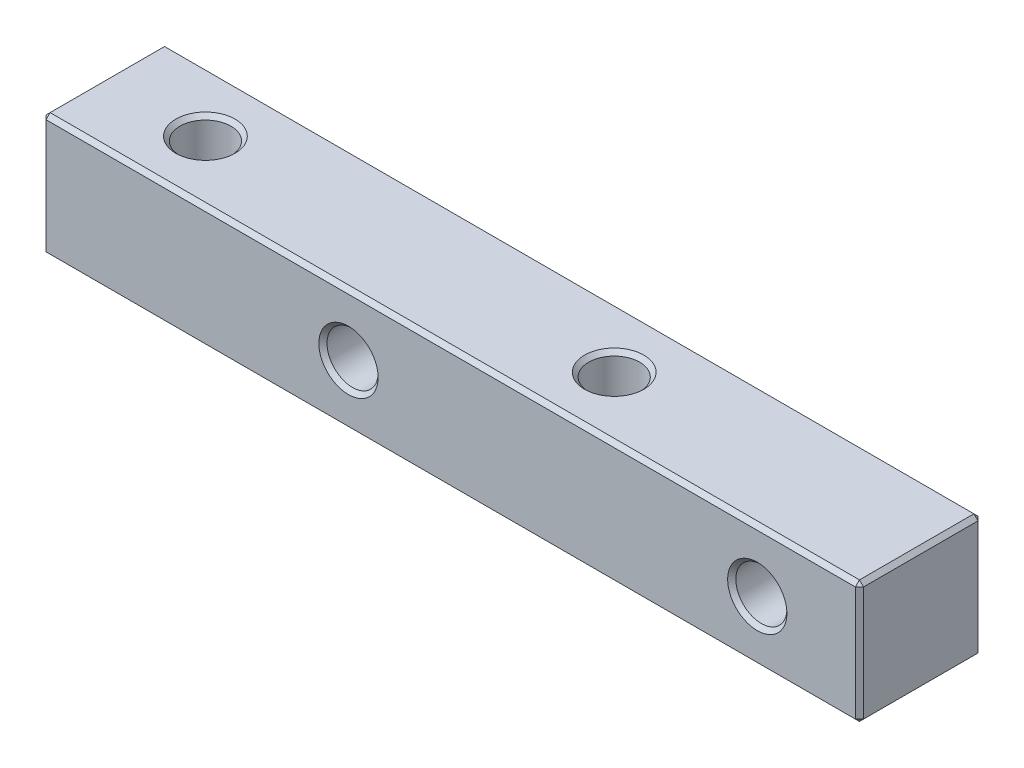
ISO-10303-21;
HEADER;
FILE_DESCRIPTION(('STEP AP214'),'2;1');
FILE_NAME('part.step','',(''),(''),'','','');
FILE_SCHEMA(('AUTOMOTIVE_DESIGN { 1 0 10303 214 1 1 1 1 }'));
ENDSEC;
DATA;
#1=APPLICATION_CONTEXT('core data for automotive mechanical design processes');
#2=APPLICATION_PROTOCOL_DEFINITION('international standard','automotive_design',2000,#1);
#3=PRODUCT_CONTEXT('',#1,'mechanical');
#4=PRODUCT('Part','Part','',(#3));
#5=PRODUCT_RELATED_PRODUCT_CATEGORY('part','',(#4));
#6=PRODUCT_DEFINITION_FORMATION('','',#4);
#7=PRODUCT_DEFINITION_CONTEXT('part definition',#1,'design');
#8=PRODUCT_DEFINITION('design','',#6,#7);
#9=PRODUCT_DEFINITION_SHAPE('','',#8);
#10=(LENGTH_UNIT() NAMED_UNIT(*) SI_UNIT(.MILLI.,.METRE.));
#11=(NAMED_UNIT(*) PLANE_ANGLE_UNIT() SI_UNIT($,.RADIAN.));
#12=(NAMED_UNIT(*) SI_UNIT($,.STERADIAN.) SOLID_ANGLE_UNIT());
#13=UNCERTAINTY_MEASURE_WITH_UNIT(LENGTH_MEASURE(1.E-05),#10,'distance_accuracy_value','');
#14=(GEOMETRIC_REPRESENTATION_CONTEXT(3) GLOBAL_UNCERTAINTY_ASSIGNED_CONTEXT((#13)) GLOBAL_UNIT_ASSIGNED_CONTEXT((#10,
#11,#12)) REPRESENTATION_CONTEXT('',''));
#15=CARTESIAN_POINT('',(0.,0.,0.));
#16=DIRECTION('',(0.,0.,1.));
#17=DIRECTION('',(1.,0.,0.));
#18=AXIS2_PLACEMENT_3D('',#15,#16,#17);
#19=CARTESIAN_POINT('',(20.,3.,-3.));
#20=DIRECTION('',(-1.,0.,0.));
#21=DIRECTION('',(0.,0.,1.));
#22=AXIS2_PLACEMENT_3D('',#19,#20,#21);
#23=PLANE('',#22);
#24=DIRECTION('',(0.,-1.,0.));
#25=VECTOR('',#24,1.);
#26=CARTESIAN_POINT('',(20.,3.,2.80000000000001));
#27=LINE('',#26,#25);
#28=CARTESIAN_POINT('',(20.,2.80000000000001,2.80000000000001));
#29=VERTEX_POINT('',#28);
#30=CARTESIAN_POINT('',(20.,-2.80000000000001,2.80000000000001));
#31=VERTEX_POINT('',#30);
#32=EDGE_CURVE('E240',#29,#31,#27,.T.);
#33=ORIENTED_EDGE('',*,*,#32,.T.);
#34=DIRECTION('',(0.,0.,-1.));
#35=VECTOR('',#34,1.);
#36=CARTESIAN_POINT('',(20.,-2.80000000000001,-3.));
#37=LINE('',#36,#35);
#38=CARTESIAN_POINT('',(20.,-2.80000000000001,-2.80000000000001));
#39=VERTEX_POINT('',#38);
#40=EDGE_CURVE('E242',#31,#39,#37,.T.);
#41=ORIENTED_EDGE('',*,*,#40,.T.);
#42=DIRECTION('',(0.,1.,0.));
#43=VECTOR('',#42,1.);
#44=CARTESIAN_POINT('',(20.,3.,-2.80000000000001));
#45=LINE('',#44,#43);
#46=CARTESIAN_POINT('',(20.,2.80000000000001,-2.80000000000001));
#47=VERTEX_POINT('',#46);
#48=EDGE_CURVE('E236',#39,#47,#45,.T.);
#49=ORIENTED_EDGE('',*,*,#48,.T.);
#50=DIRECTION('',(0.,0.,1.));
#51=VECTOR('',#50,1.);
#52=CARTESIAN_POINT('',(20.,2.80000000000001,3.));
#53=LINE('',#52,#51);
#54=EDGE_CURVE('E238',#47,#29,#53,.T.);
#55=ORIENTED_EDGE('',*,*,#54,.T.);
#56=EDGE_LOOP('',(#33,#41,#49,#55));
#57=FACE_BOUND('',#56,.T.);
#58=ADVANCED_FACE('F40',(#57),#23,.F.);
#59=CARTESIAN_POINT('',(-20.,3.,-3.));
#60=DIRECTION('',(0.,0.,1.));
#61=DIRECTION('',(1.,0.,0.));
#62=AXIS2_PLACEMENT_3D('',#59,#60,#61);
#63=PLANE('',#62);
#64=DIRECTION('',(1.,0.,0.));
#65=VECTOR('',#64,1.);
#66=CARTESIAN_POINT('',(20.,2.80000000000001,-3.));
#67=LINE('',#66,#65);
#68=CARTESIAN_POINT('',(-19.8,2.80000000000001,-3.));
#69=VERTEX_POINT('',#68);
#70=CARTESIAN_POINT('',(19.8,2.80000000000001,-3.));
#71=VERTEX_POINT('',#70);
#72=EDGE_CURVE('E50',#69,#71,#67,.T.);
#73=ORIENTED_EDGE('',*,*,#72,.T.);
#74=DIRECTION('',(0.,-1.,0.));
#75=VECTOR('',#74,1.);
#76=CARTESIAN_POINT('',(19.8,3.,-3.));
#77=LINE('',#76,#75);
#78=CARTESIAN_POINT('',(19.8,-2.80000000000001,-3.));
#79=VERTEX_POINT('',#78);
#80=EDGE_CURVE('E11',#71,#79,#77,.T.);
#81=ORIENTED_EDGE('',*,*,#80,.T.);
#82=DIRECTION('',(-1.,0.,0.));
#83=VECTOR('',#82,1.);
#84=CARTESIAN_POINT('',(-20.,-2.80000000000001,-3.));
#85=LINE('',#84,#83);
#86=CARTESIAN_POINT('',(-19.8,-2.80000000000001,-3.));
#87=VERTEX_POINT('',#86);
#88=EDGE_CURVE('E251',#79,#87,#85,.T.);
#89=ORIENTED_EDGE('',*,*,#88,.T.);
#90=DIRECTION('',(0.,1.,0.));
#91=VECTOR('',#90,1.);
#92=CARTESIAN_POINT('',(-19.8,3.,-3.));
#93=LINE('',#92,#91);
#94=EDGE_CURVE('E61',#87,#69,#93,.T.);
#95=ORIENTED_EDGE('',*,*,#94,.T.);
#96=EDGE_LOOP('',(#73,#81,#89,#95));
#97=FACE_BOUND('',#96,.T.);
#98=CARTESIAN_POINT('',(-5.,0.,-3.));
#99=DIRECTION('',(0.,0.,1.));
#100=DIRECTION('',(1.,0.,0.));
#101=AXIS2_PLACEMENT_3D('',#98,#99,#100);
#102=CIRCLE('',#101,1.44999999999998);
#103=CARTESIAN_POINT('',(-3.55000000000002,0.,-3.));
#104=VERTEX_POINT('',#103);
#105=EDGE_CURVE('E248',#104,#104,#102,.T.);
#106=ORIENTED_EDGE('',*,*,#105,.T.);
#107=EDGE_LOOP('',(#106));
#108=FACE_BOUND('',#107,.T.);
#109=CARTESIAN_POINT('',(15.,0.,-3.));
#110=DIRECTION('',(0.,0.,1.));
#111=DIRECTION('',(1.,0.,0.));
#112=AXIS2_PLACEMENT_3D('',#109,#110,#111);
#113=CIRCLE('',#112,1.44999999999998);
#114=CARTESIAN_POINT('',(16.45,0.,-3.));
#115=VERTEX_POINT('',#114);
#116=EDGE_CURVE('E245',#115,#115,#113,.T.);
#117=ORIENTED_EDGE('',*,*,#116,.T.);
#118=EDGE_LOOP('',(#117));
#119=FACE_BOUND('',#118,.T.);
#120=ADVANCED_FACE('F323',(#97,#108,#119),#63,.F.);
#121=CARTESIAN_POINT('',(-20.,3.,-3.));
#122=DIRECTION('',(1.,0.,0.));
#123=DIRECTION('',(0.,0.,-1.));
#124=AXIS2_PLACEMENT_3D('',#121,#122,#123);
#125=PLANE('',#124);
#126=DIRECTION('',(0.,-1.,0.));
#127=VECTOR('',#126,1.);
#128=CARTESIAN_POINT('',(-20.,3.,-2.80000000000001));
#129=LINE('',#128,#127);
#130=CARTESIAN_POINT('',(-20.,2.80000000000001,-2.80000000000001));
#131=VERTEX_POINT('',#130);
#132=CARTESIAN_POINT('',(-20.,-2.80000000000001,-2.80000000000001));
#133=VERTEX_POINT('',#132);
#134=EDGE_CURVE('E229',#131,#133,#129,.T.);
#135=ORIENTED_EDGE('',*,*,#134,.T.);
#136=DIRECTION('',(0.,0.,1.));
#137=VECTOR('',#136,1.);
#138=CARTESIAN_POINT('',(-20.,-2.80000000000001,-3.));
#139=LINE('',#138,#137);
#140=CARTESIAN_POINT('',(-20.,-2.80000000000001,2.80000000000001));
#141=VERTEX_POINT('',#140);
#142=EDGE_CURVE('E137',#133,#141,#139,.T.);
#143=ORIENTED_EDGE('',*,*,#142,.T.);
#144=DIRECTION('',(0.,1.,0.));
#145=VECTOR('',#144,1.);
#146=CARTESIAN_POINT('',(-20.,3.,2.80000000000001));
#147=LINE('',#146,#145);
#148=CARTESIAN_POINT('',(-20.,2.80000000000001,2.80000000000001));
#149=VERTEX_POINT('',#148);
#150=EDGE_CURVE('E233',#141,#149,#147,.T.);
#151=ORIENTED_EDGE('',*,*,#150,.T.);
#152=DIRECTION('',(0.,0.,-1.));
#153=VECTOR('',#152,1.);
#154=CARTESIAN_POINT('',(-20.,2.80000000000001,-3.));
#155=LINE('',#154,#153);
#156=EDGE_CURVE('E231',#149,#131,#155,.T.);
#157=ORIENTED_EDGE('',*,*,#156,.T.);
#158=EDGE_LOOP('',(#135,#143,#151,#157));
#159=FACE_BOUND('',#158,.T.);
#160=ADVANCED_FACE('F380',(#159),#125,.F.);
#161=CARTESIAN_POINT('',(-20.,3.,3.));
#162=DIRECTION('',(0.,0.,-1.));
#163=DIRECTION('',(-1.,0.,0.));
#164=AXIS2_PLACEMENT_3D('',#161,#162,#163);
#165=PLANE('',#164);
#166=CARTESIAN_POINT('',(-5.,0.,3.));
#167=DIRECTION('',(0.,0.,-1.));
#168=DIRECTION('',(-1.,0.,0.));
#169=AXIS2_PLACEMENT_3D('',#166,#167,#168);
#170=CIRCLE('',#169,1.45);
#171=CARTESIAN_POINT('',(-6.45,0.,3.));
#172=VERTEX_POINT('',#171);
#173=EDGE_CURVE('E199',#172,#172,#170,.T.);
#174=ORIENTED_EDGE('',*,*,#173,.T.);
#175=EDGE_LOOP('',(#174));
#176=FACE_BOUND('',#175,.T.);
#177=CARTESIAN_POINT('',(15.,0.,3.));
#178=DIRECTION('',(0.,0.,-1.));
#179=DIRECTION('',(-1.,0.,0.));
#180=AXIS2_PLACEMENT_3D('',#177,#178,#179);
#181=CIRCLE('',#180,1.45000000000001);
#182=CARTESIAN_POINT('',(13.55,0.,3.));
#183=VERTEX_POINT('',#182);
#184=EDGE_CURVE('E196',#183,#183,#181,.T.);
#185=ORIENTED_EDGE('',*,*,#184,.T.);
#186=EDGE_LOOP('',(#185));
#187=FACE_BOUND('',#186,.T.);
#188=DIRECTION('',(-1.,0.,0.));
#189=VECTOR('',#188,1.);
#190=CARTESIAN_POINT('',(-20.,2.80000000000001,3.));
#191=LINE('',#190,#189);
#192=CARTESIAN_POINT('',(19.8,2.80000000000001,3.));
#193=VERTEX_POINT('',#192);
#194=CARTESIAN_POINT('',(-19.8,2.80000000000001,3.));
#195=VERTEX_POINT('',#194);
#196=EDGE_CURVE('E187',#193,#195,#191,.T.);
#197=ORIENTED_EDGE('',*,*,#196,.T.);
#198=DIRECTION('',(0.,-1.,0.));
#199=VECTOR('',#198,1.);
#200=CARTESIAN_POINT('',(-19.8,3.,3.));
#201=LINE('',#200,#199);
#202=CARTESIAN_POINT('',(-19.8,-2.80000000000001,3.));
#203=VERTEX_POINT('',#202);
#204=EDGE_CURVE('E193',#195,#203,#201,.T.);
#205=ORIENTED_EDGE('',*,*,#204,.T.);
#206=DIRECTION('',(1.,0.,0.));
#207=VECTOR('',#206,1.);
#208=CARTESIAN_POINT('',(-20.,-2.80000000000001,3.));
#209=LINE('',#208,#207);
#210=CARTESIAN_POINT('',(19.8,-2.80000000000001,3.));
#211=VERTEX_POINT('',#210);
#212=EDGE_CURVE('E191',#203,#211,#209,.T.);
#213=ORIENTED_EDGE('',*,*,#212,.T.);
#214=DIRECTION('',(0.,1.,0.));
#215=VECTOR('',#214,1.);
#216=CARTESIAN_POINT('',(19.8,3.,3.));
#217=LINE('',#216,#215);
#218=EDGE_CURVE('E189',#211,#193,#217,.T.);
#219=ORIENTED_EDGE('',*,*,#218,.T.);
#220=EDGE_LOOP('',(#197,#205,#213,#219));
#221=FACE_BOUND('',#220,.T.);
#222=ADVANCED_FACE('F555',(#176,#187,#221),#165,.F.);
#223=CARTESIAN_POINT('',(0.,3.,0.));
#224=DIRECTION('',(0.,1.,0.));
#225=DIRECTION('',(0.,0.,1.));
#226=AXIS2_PLACEMENT_3D('',#223,#224,#225);
#227=PLANE('',#226);
#228=CARTESIAN_POINT('',(5.,3.,0.));
#229=DIRECTION('',(0.,1.,0.));
#230=DIRECTION('',(0.,0.,1.));
#231=AXIS2_PLACEMENT_3D('',#228,#229,#230);
#232=CIRCLE('',#231,1.44999999999998);
#233=CARTESIAN_POINT('',(5.,3.,1.44999999999998));
#234=VERTEX_POINT('',#233);
#235=EDGE_CURVE('E226',#234,#234,#232,.F.);
#236=ORIENTED_EDGE('',*,*,#235,.T.);
#237=EDGE_LOOP('',(#236));
#238=FACE_BOUND('',#237,.T.);
#239=CARTESIAN_POINT('',(-15.,3.,0.));
#240=DIRECTION('',(0.,1.,0.));
#241=DIRECTION('',(0.,0.,1.));
#242=AXIS2_PLACEMENT_3D('',#239,#240,#241);
#243=CIRCLE('',#242,1.44999999999998);
#244=CARTESIAN_POINT('',(-15.,3.,1.44999999999998));
#245=VERTEX_POINT('',#244);
#246=EDGE_CURVE('E223',#245,#245,#243,.F.);
#247=ORIENTED_EDGE('',*,*,#246,.T.);
#248=EDGE_LOOP('',(#247));
#249=FACE_BOUND('',#248,.T.);
#250=DIRECTION('',(0.,0.,1.));
#251=VECTOR('',#250,1.);
#252=CARTESIAN_POINT('',(-19.8,3.,3.));
#253=LINE('',#252,#251);
#254=CARTESIAN_POINT('',(-19.8,3.,-2.80000000000001));
#255=VERTEX_POINT('',#254);
#256=CARTESIAN_POINT('',(-19.8,3.,2.80000000000001));
#257=VERTEX_POINT('',#256);
#258=EDGE_CURVE('E218',#255,#257,#253,.T.);
#259=ORIENTED_EDGE('',*,*,#258,.T.);
#260=DIRECTION('',(1.,0.,0.));
#261=VECTOR('',#260,1.);
#262=CARTESIAN_POINT('',(20.,3.,2.80000000000001));
#263=LINE('',#262,#261);
#264=CARTESIAN_POINT('',(19.8,3.,2.80000000000001));
#265=VERTEX_POINT('',#264);
#266=EDGE_CURVE('E220',#257,#265,#263,.T.);
#267=ORIENTED_EDGE('',*,*,#266,.T.);
#268=DIRECTION('',(0.,0.,-1.));
#269=VECTOR('',#268,1.);
#270=CARTESIAN_POINT('',(19.8,3.,-3.));
#271=LINE('',#270,#269);
#272=CARTESIAN_POINT('',(19.8,3.,-2.80000000000001));
#273=VERTEX_POINT('',#272);
#274=EDGE_CURVE('E216',#265,#273,#271,.T.);
#275=ORIENTED_EDGE('',*,*,#274,.T.);
#276=DIRECTION('',(-1.,0.,0.));
#277=VECTOR('',#276,1.);
#278=CARTESIAN_POINT('',(-20.,3.,-2.80000000000001));
#279=LINE('',#278,#277);
#280=EDGE_CURVE('E214',#273,#255,#279,.T.);
#281=ORIENTED_EDGE('',*,*,#280,.T.);
#282=EDGE_LOOP('',(#259,#267,#275,#281));
#283=FACE_BOUND('',#282,.T.);
#284=ADVANCED_FACE('F337',(#238,#249,#283),#227,.T.);
#285=CARTESIAN_POINT('',(0.,-3.,0.));
#286=DIRECTION('',(0.,1.,0.));
#287=DIRECTION('',(0.,0.,1.));
#288=AXIS2_PLACEMENT_3D('',#285,#286,#287);
#289=PLANE('',#288);
#290=CARTESIAN_POINT('',(5.,-3.,0.));
#291=DIRECTION('',(0.,1.,0.));
#292=DIRECTION('',(0.,0.,1.));
#293=AXIS2_PLACEMENT_3D('',#290,#291,#292);
#294=CIRCLE('',#293,1.45);
#295=CARTESIAN_POINT('',(5.,-3.,1.45));
#296=VERTEX_POINT('',#295);
#297=EDGE_CURVE('E172',#296,#296,#294,.T.);
#298=ORIENTED_EDGE('',*,*,#297,.T.);
#299=EDGE_LOOP('',(#298));
#300=FACE_BOUND('',#299,.T.);
#301=CARTESIAN_POINT('',(-15.,-3.,0.));
#302=DIRECTION('',(0.,1.,0.));
#303=DIRECTION('',(0.,0.,1.));
#304=AXIS2_PLACEMENT_3D('',#301,#302,#303);
#305=CIRCLE('',#304,1.45);
#306=CARTESIAN_POINT('',(-15.,-3.,1.45));
#307=VERTEX_POINT('',#306);
#308=EDGE_CURVE('E166',#307,#307,#305,.T.);
#309=ORIENTED_EDGE('',*,*,#308,.T.);
#310=EDGE_LOOP('',(#309));
#311=FACE_BOUND('',#310,.T.);
#312=DIRECTION('',(0.,0.,1.));
#313=VECTOR('',#312,1.);
#314=CARTESIAN_POINT('',(19.8,-3.,0.));
#315=LINE('',#314,#313);
#316=CARTESIAN_POINT('',(19.8,-3.,-2.80000000000001));
#317=VERTEX_POINT('',#316);
#318=CARTESIAN_POINT('',(19.8,-3.,2.80000000000001));
#319=VERTEX_POINT('',#318);
#320=EDGE_CURVE('E159',#317,#319,#315,.T.);
#321=ORIENTED_EDGE('',*,*,#320,.T.);
#322=DIRECTION('',(-1.,0.,0.));
#323=VECTOR('',#322,1.);
#324=CARTESIAN_POINT('',(0.,-3.,2.80000000000001));
#325=LINE('',#324,#323);
#326=CARTESIAN_POINT('',(-19.8,-3.,2.80000000000001));
#327=VERTEX_POINT('',#326);
#328=EDGE_CURVE('E163',#319,#327,#325,.T.);
#329=ORIENTED_EDGE('',*,*,#328,.T.);
#330=DIRECTION('',(0.,0.,-1.));
#331=VECTOR('',#330,1.);
#332=CARTESIAN_POINT('',(-19.8,-3.,0.));
#333=LINE('',#332,#331);
#334=CARTESIAN_POINT('',(-19.8,-3.,-2.80000000000001));
#335=VERTEX_POINT('',#334);
#336=EDGE_CURVE('E134',#327,#335,#333,.T.);
#337=ORIENTED_EDGE('',*,*,#336,.T.);
#338=DIRECTION('',(1.,0.,0.));
#339=VECTOR('',#338,1.);
#340=CARTESIAN_POINT('',(0.,-3.,-2.80000000000001));
#341=LINE('',#340,#339);
#342=EDGE_CURVE('E153',#335,#317,#341,.T.);
#343=ORIENTED_EDGE('',*,*,#342,.T.);
#344=EDGE_LOOP('',(#321,#329,#337,#343));
#345=FACE_BOUND('',#344,.T.);
#346=ADVANCED_FACE('F161',(#300,#311,#345),#289,.F.);
#347=CARTESIAN_POINT('',(5.,3.,0.));
#348=DIRECTION('',(0.,1.,0.));
#349=DIRECTION('',(0.,0.,1.));
#350=AXIS2_PLACEMENT_3D('',#347,#348,#349);
#351=CYLINDRICAL_SURFACE('',#350,1.24999999999999);
#352=CARTESIAN_POINT('',(5.,-2.79999999999999,0.));
#353=DIRECTION('',(0.,1.,0.));
#354=DIRECTION('',(0.,0.,1.));
#355=AXIS2_PLACEMENT_3D('',#352,#353,#354);
#356=CIRCLE('',#355,1.24999999999999);
#357=CARTESIAN_POINT('',(5.,-2.79999999999999,1.24999999999999));
#358=VERTEX_POINT('',#357);
#359=EDGE_CURVE('E178',#358,#358,#356,.F.);
#360=ORIENTED_EDGE('',*,*,#359,.T.);
#361=EDGE_LOOP('',(#360));
#362=FACE_BOUND('',#361,.T.);
#363=CARTESIAN_POINT('',(5.,2.80000000000001,0.));
#364=DIRECTION('',(0.,1.,0.));
#365=DIRECTION('',(0.,0.,1.));
#366=AXIS2_PLACEMENT_3D('',#363,#364,#365);
#367=CIRCLE('',#366,1.24999999999999);
#368=CARTESIAN_POINT('',(5.,2.80000000000001,1.24999999999999));
#369=VERTEX_POINT('',#368);
#370=EDGE_CURVE('E175',#369,#369,#367,.T.);
#371=ORIENTED_EDGE('',*,*,#370,.T.);
#372=EDGE_LOOP('',(#371));
#373=FACE_BOUND('',#372,.T.);
#374=ADVANCED_FACE('F546',(#362,#373),#351,.F.);
#375=CARTESIAN_POINT('',(-15.,3.,0.));
#376=DIRECTION('',(0.,1.,0.));
#377=DIRECTION('',(0.,0.,1.));
#378=AXIS2_PLACEMENT_3D('',#375,#376,#377);
#379=CYLINDRICAL_SURFACE('',#378,1.24999999999999);
#380=CARTESIAN_POINT('',(-15.,-2.79999999999999,0.));
#381=DIRECTION('',(0.,1.,0.));
#382=DIRECTION('',(0.,0.,1.));
#383=AXIS2_PLACEMENT_3D('',#380,#381,#382);
#384=CIRCLE('',#383,1.24999999999999);
#385=CARTESIAN_POINT('',(-15.,-2.79999999999999,1.24999999999999));
#386=VERTEX_POINT('',#385);
#387=EDGE_CURVE('E184',#386,#386,#384,.F.);
#388=ORIENTED_EDGE('',*,*,#387,.T.);
#389=EDGE_LOOP('',(#388));
#390=FACE_BOUND('',#389,.T.);
#391=CARTESIAN_POINT('',(-15.,2.80000000000001,0.));
#392=DIRECTION('',(0.,1.,0.));
#393=DIRECTION('',(0.,0.,1.));
#394=AXIS2_PLACEMENT_3D('',#391,#392,#393);
#395=CIRCLE('',#394,1.24999999999999);
#396=CARTESIAN_POINT('',(-15.,2.80000000000001,1.24999999999999));
#397=VERTEX_POINT('',#396);
#398=EDGE_CURVE('E181',#397,#397,#395,.T.);
#399=ORIENTED_EDGE('',*,*,#398,.T.);
#400=EDGE_LOOP('',(#399));
#401=FACE_BOUND('',#400,.T.);
#402=ADVANCED_FACE('F537',(#390,#401),#379,.F.);
#403=CARTESIAN_POINT('',(-5.,0.,-3.));
#404=DIRECTION('',(0.,0.,-1.));
#405=DIRECTION('',(-1.,0.,0.));
#406=AXIS2_PLACEMENT_3D('',#403,#404,#405);
#407=CYLINDRICAL_SURFACE('',#406,1.24999999999999);
#408=CARTESIAN_POINT('',(-5.,0.,2.8));
#409=DIRECTION('',(0.,0.,-1.));
#410=DIRECTION('',(-1.,0.,0.));
#411=AXIS2_PLACEMENT_3D('',#408,#409,#410);
#412=CIRCLE('',#411,1.24999999999999);
#413=CARTESIAN_POINT('',(-6.24999999999999,0.,2.8));
#414=VERTEX_POINT('',#413);
#415=EDGE_CURVE('E205',#414,#414,#412,.F.);
#416=ORIENTED_EDGE('',*,*,#415,.T.);
#417=EDGE_LOOP('',(#416));
#418=FACE_BOUND('',#417,.T.);
#419=CARTESIAN_POINT('',(-5.,0.,-2.80000000000001));
#420=DIRECTION('',(0.,0.,1.));
#421=DIRECTION('',(1.,0.,0.));
#422=AXIS2_PLACEMENT_3D('',#419,#420,#421);
#423=CIRCLE('',#422,1.24999999999999);
#424=CARTESIAN_POINT('',(-3.75000000000001,0.,-2.80000000000001));
#425=VERTEX_POINT('',#424);
#426=EDGE_CURVE('E202',#425,#425,#423,.F.);
#427=ORIENTED_EDGE('',*,*,#426,.T.);
#428=EDGE_LOOP('',(#427));
#429=FACE_BOUND('',#428,.T.);
#430=ADVANCED_FACE('F535',(#418,#429),#407,.F.);
#431=CARTESIAN_POINT('',(15.,0.,-3.));
#432=DIRECTION('',(0.,0.,-1.));
#433=DIRECTION('',(-1.,0.,0.));
#434=AXIS2_PLACEMENT_3D('',#431,#432,#433);
#435=CYLINDRICAL_SURFACE('',#434,1.24999999999999);
#436=CARTESIAN_POINT('',(15.,0.,2.79999999999999));
#437=DIRECTION('',(0.,0.,-1.));
#438=DIRECTION('',(-1.,0.,0.));
#439=AXIS2_PLACEMENT_3D('',#436,#437,#438);
#440=CIRCLE('',#439,1.24999999999999);
#441=CARTESIAN_POINT('',(13.75,0.,2.79999999999999));
#442=VERTEX_POINT('',#441);
#443=EDGE_CURVE('E211',#442,#442,#440,.F.);
#444=ORIENTED_EDGE('',*,*,#443,.T.);
#445=EDGE_LOOP('',(#444));
#446=FACE_BOUND('',#445,.T.);
#447=CARTESIAN_POINT('',(15.,0.,-2.80000000000001));
#448=DIRECTION('',(0.,0.,1.));
#449=DIRECTION('',(1.,0.,0.));
#450=AXIS2_PLACEMENT_3D('',#447,#448,#449);
#451=CIRCLE('',#450,1.24999999999999);
#452=CARTESIAN_POINT('',(16.25,0.,-2.80000000000001));
#453=VERTEX_POINT('',#452);
#454=EDGE_CURVE('E208',#453,#453,#451,.F.);
#455=ORIENTED_EDGE('',*,*,#454,.T.);
#456=EDGE_LOOP('',(#455));
#457=FACE_BOUND('',#456,.T.);
#458=ADVANCED_FACE('F392',(#446,#457),#435,.F.);
#459=CARTESIAN_POINT('',(5.,-3.,0.));
#460=DIRECTION('',(0.,-1.,0.));
#461=DIRECTION('',(0.,0.,-1.));
#462=AXIS2_PLACEMENT_3D('',#459,#460,#461);
#463=CONICAL_SURFACE('',#462,1.45,0.78539816339744);
#464=ORIENTED_EDGE('',*,*,#359,.F.);
#465=EDGE_LOOP('',(#464));
#466=FACE_BOUND('',#465,.T.);
#467=ORIENTED_EDGE('',*,*,#297,.F.);
#468=EDGE_LOOP('',(#467));
#469=FACE_BOUND('',#468,.T.);
#470=ADVANCED_FACE('F385',(#466,#469),#463,.F.);
#471=CARTESIAN_POINT('',(-15.,-3.,0.));
#472=DIRECTION('',(0.,-1.,0.));
#473=DIRECTION('',(0.,0.,-1.));
#474=AXIS2_PLACEMENT_3D('',#471,#472,#473);
#475=CONICAL_SURFACE('',#474,1.45,0.78539816339744);
#476=ORIENTED_EDGE('',*,*,#387,.F.);
#477=EDGE_LOOP('',(#476));
#478=FACE_BOUND('',#477,.T.);
#479=ORIENTED_EDGE('',*,*,#308,.F.);
#480=EDGE_LOOP('',(#479));
#481=FACE_BOUND('',#480,.T.);
#482=ADVANCED_FACE('F391',(#478,#481),#475,.F.);
#483=CARTESIAN_POINT('',(-5.,0.,3.));
#484=DIRECTION('',(0.,0.,1.));
#485=DIRECTION('',(1.,0.,0.));
#486=AXIS2_PLACEMENT_3D('',#483,#484,#485);
#487=CONICAL_SURFACE('',#486,1.45,0.785398163397448);
#488=ORIENTED_EDGE('',*,*,#415,.F.);
#489=EDGE_LOOP('',(#488));
#490=FACE_BOUND('',#489,.T.);
#491=ORIENTED_EDGE('',*,*,#173,.F.);
#492=EDGE_LOOP('',(#491));
#493=FACE_BOUND('',#492,.T.);
#494=ADVANCED_FACE('F399',(#490,#493),#487,.F.);
#495=CARTESIAN_POINT('',(15.,0.,3.));
#496=DIRECTION('',(0.,0.,1.));
#497=DIRECTION('',(1.,0.,0.));
#498=AXIS2_PLACEMENT_3D('',#495,#496,#497);
#499=CONICAL_SURFACE('',#498,1.45000000000001,0.785398163397455);
#500=ORIENTED_EDGE('',*,*,#443,.F.);
#501=EDGE_LOOP('',(#500));
#502=FACE_BOUND('',#501,.T.);
#503=ORIENTED_EDGE('',*,*,#184,.F.);
#504=EDGE_LOOP('',(#503));
#505=FACE_BOUND('',#504,.T.);
#506=ADVANCED_FACE('F406',(#502,#505),#499,.F.);
#507=CARTESIAN_POINT('',(5.,2.80000000000001,0.));
#508=DIRECTION('',(0.,1.,0.));
#509=DIRECTION('',(0.,0.,1.));
#510=AXIS2_PLACEMENT_3D('',#507,#508,#509);
#511=CONICAL_SURFACE('',#510,1.24999999999999,0.785398163397448);
#512=ORIENTED_EDGE('',*,*,#235,.F.);
#513=EDGE_LOOP('',(#512));
#514=FACE_BOUND('',#513,.T.);
#515=ORIENTED_EDGE('',*,*,#370,.F.);
#516=EDGE_LOOP('',(#515));
#517=FACE_BOUND('',#516,.T.);
#518=ADVANCED_FACE('F413',(#514,#517),#511,.F.);
#519=CARTESIAN_POINT('',(-15.,2.80000000000001,0.));
#520=DIRECTION('',(0.,1.,0.));
#521=DIRECTION('',(0.,0.,1.));
#522=AXIS2_PLACEMENT_3D('',#519,#520,#521);
#523=CONICAL_SURFACE('',#522,1.24999999999999,0.785398163397448);
#524=ORIENTED_EDGE('',*,*,#246,.F.);
#525=EDGE_LOOP('',(#524));
#526=FACE_BOUND('',#525,.T.);
#527=ORIENTED_EDGE('',*,*,#398,.F.);
#528=EDGE_LOOP('',(#527));
#529=FACE_BOUND('',#528,.T.);
#530=ADVANCED_FACE('F420',(#526,#529),#523,.F.);
#531=CARTESIAN_POINT('',(19.8,3.,0.));
#532=DIRECTION('',(0.707106781186541,0.707106781186554,0.));
#533=DIRECTION('',(0.,0.,1.));
#534=AXIS2_PLACEMENT_3D('',#531,#532,#533);
#535=PLANE('',#534);
#536=DIRECTION('',(0.707106781186554,-0.707106781186541,0.));
#537=VECTOR('',#536,1.);
#538=CARTESIAN_POINT('',(19.8,3.,-2.80000000000001));
#539=LINE('',#538,#537);
#540=EDGE_CURVE('E45',#273,#47,#539,.T.);
#541=ORIENTED_EDGE('',*,*,#540,.F.);
#542=ORIENTED_EDGE('',*,*,#274,.F.);
#543=DIRECTION('',(-0.707106781186554,0.707106781186541,0.));
#544=VECTOR('',#543,1.);
#545=CARTESIAN_POINT('',(19.9,2.9,2.80000000000001));
#546=LINE('',#545,#544);
#547=EDGE_CURVE('E302',#29,#265,#546,.T.);
#548=ORIENTED_EDGE('',*,*,#547,.F.);
#549=ORIENTED_EDGE('',*,*,#54,.F.);
#550=EDGE_LOOP('',(#541,#542,#548,#549));
#551=FACE_BOUND('',#550,.T.);
#552=ADVANCED_FACE('F427',(#551),#535,.T.);
#553=CARTESIAN_POINT('',(19.8,3.,-2.80000000000001));
#554=DIRECTION('',(0.577350269189616,0.577350269189626,-0.577350269189636));
#555=DIRECTION('',(0.,0.707106781186554,0.707106781186541));
#556=AXIS2_PLACEMENT_3D('',#553,#554,#555);
#557=PLANE('',#556);
#558=DIRECTION('',(0.,0.707106781186554,0.707106781186541));
#559=VECTOR('',#558,1.);
#560=CARTESIAN_POINT('',(19.8,3.,-2.80000000000001));
#561=LINE('',#560,#559);
#562=EDGE_CURVE('E298',#273,#71,#561,.F.);
#563=ORIENTED_EDGE('',*,*,#562,.F.);
#564=ORIENTED_EDGE('',*,*,#540,.T.);
#565=DIRECTION('',(0.707106781186554,0.,0.707106781186541));
#566=VECTOR('',#565,1.);
#567=CARTESIAN_POINT('',(19.9,2.80000000000001,-2.90000000000001));
#568=LINE('',#567,#566);
#569=EDGE_CURVE('E300',#71,#47,#568,.T.);
#570=ORIENTED_EDGE('',*,*,#569,.F.);
#571=EDGE_LOOP('',(#563,#564,#570));
#572=FACE_BOUND('',#571,.T.);
#573=ADVANCED_FACE('F314',(#572),#557,.T.);
#574=CARTESIAN_POINT('',(19.8,2.80000000000001,3.));
#575=DIRECTION('',(0.577350269189629,0.577350269189639,0.577350269189609));
#576=DIRECTION('',(-0.707106781186554,0.707106781186541,0.));
#577=AXIS2_PLACEMENT_3D('',#574,#575,#576);
#578=PLANE('',#577);
#579=DIRECTION('',(-0.707106781186535,0.,0.70710678118656));
#580=VECTOR('',#579,1.);
#581=CARTESIAN_POINT('',(19.8,2.80000000000001,3.));
#582=LINE('',#581,#580);
#583=EDGE_CURVE('E293',#29,#193,#582,.T.);
#584=ORIENTED_EDGE('',*,*,#583,.F.);
#585=ORIENTED_EDGE('',*,*,#547,.T.);
#586=DIRECTION('',(0.,-0.707106781186541,0.707106781186554));
#587=VECTOR('',#586,1.);
#588=CARTESIAN_POINT('',(19.8,2.80000000000001,3.));
#589=LINE('',#588,#587);
#590=EDGE_CURVE('E296',#193,#265,#589,.F.);
#591=ORIENTED_EDGE('',*,*,#590,.F.);
#592=EDGE_LOOP('',(#584,#585,#591));
#593=FACE_BOUND('',#592,.T.);
#594=ADVANCED_FACE('F351',(#593),#578,.T.);
#595=CARTESIAN_POINT('',(19.8,3.,-3.));
#596=DIRECTION('',(-0.707106781186541,0.,0.707106781186554));
#597=DIRECTION('',(0.,-1.,0.));
#598=AXIS2_PLACEMENT_3D('',#595,#596,#597);
#599=PLANE('',#598);
#600=ORIENTED_EDGE('',*,*,#569,.T.);
#601=ORIENTED_EDGE('',*,*,#48,.F.);
#602=DIRECTION('',(-0.707106781186554,0.,-0.707106781186541));
#603=VECTOR('',#602,1.);
#604=CARTESIAN_POINT('',(20.,-2.80000000000001,-2.80000000000001));
#605=LINE('',#604,#603);
#606=EDGE_CURVE('E288',#79,#39,#605,.F.);
#607=ORIENTED_EDGE('',*,*,#606,.F.);
#608=ORIENTED_EDGE('',*,*,#80,.F.);
#609=EDGE_LOOP('',(#600,#601,#607,#608));
#610=FACE_BOUND('',#609,.T.);
#611=ADVANCED_FACE('F321',(#610),#599,.F.);
#612=CARTESIAN_POINT('',(0.,3.,-2.80000000000001));
#613=DIRECTION('',(0.,0.707106781186541,-0.707106781186554));
#614=DIRECTION('',(1.,0.,0.));
#615=AXIS2_PLACEMENT_3D('',#612,#613,#614);
#616=PLANE('',#615);
#617=ORIENTED_EDGE('',*,*,#562,.T.);
#618=ORIENTED_EDGE('',*,*,#72,.F.);
#619=DIRECTION('',(0.,-0.707106781186554,-0.707106781186541));
#620=VECTOR('',#619,1.);
#621=CARTESIAN_POINT('',(-19.8,2.9,-2.90000000000001));
#622=LINE('',#621,#620);
#623=EDGE_CURVE('E285',#255,#69,#622,.T.);
#624=ORIENTED_EDGE('',*,*,#623,.F.);
#625=ORIENTED_EDGE('',*,*,#280,.F.);
#626=EDGE_LOOP('',(#617,#618,#624,#625));
#627=FACE_BOUND('',#626,.T.);
#628=ADVANCED_FACE('F334',(#627),#616,.T.);
#629=CARTESIAN_POINT('',(-19.8,3.,0.));
#630=DIRECTION('',(-0.707106781186541,0.707106781186554,0.));
#631=DIRECTION('',(0.,0.,-1.));
#632=AXIS2_PLACEMENT_3D('',#629,#630,#631);
#633=PLANE('',#632);
#634=DIRECTION('',(-0.707106781186554,-0.707106781186541,0.));
#635=VECTOR('',#634,1.);
#636=CARTESIAN_POINT('',(-20.,2.80000000000001,2.80000000000001));
#637=LINE('',#636,#635);
#638=EDGE_CURVE('E279',#257,#149,#637,.T.);
#639=ORIENTED_EDGE('',*,*,#638,.F.);
#640=ORIENTED_EDGE('',*,*,#258,.F.);
#641=DIRECTION('',(0.707106781186554,0.707106781186541,0.));
#642=VECTOR('',#641,1.);
#643=CARTESIAN_POINT('',(-20.,2.80000000000001,-2.80000000000001));
#644=LINE('',#643,#642);
#645=EDGE_CURVE('E282',#131,#255,#644,.T.);
#646=ORIENTED_EDGE('',*,*,#645,.F.);
#647=ORIENTED_EDGE('',*,*,#156,.F.);
#648=EDGE_LOOP('',(#639,#640,#646,#647));
#649=FACE_BOUND('',#648,.T.);
#650=ADVANCED_FACE('F341',(#649),#633,.T.);
#651=CARTESIAN_POINT('',(0.,3.,2.80000000000001));
#652=DIRECTION('',(0.,0.707106781186554,0.707106781186541));
#653=DIRECTION('',(-1.,0.,0.));
#654=AXIS2_PLACEMENT_3D('',#651,#652,#653);
#655=PLANE('',#654);
#656=ORIENTED_EDGE('',*,*,#590,.T.);
#657=ORIENTED_EDGE('',*,*,#266,.F.);
#658=DIRECTION('',(0.,0.707106781186541,-0.707106781186554));
#659=VECTOR('',#658,1.);
#660=CARTESIAN_POINT('',(-19.8,2.90000000000001,2.9));
#661=LINE('',#660,#659);
#662=EDGE_CURVE('E276',#195,#257,#661,.T.);
#663=ORIENTED_EDGE('',*,*,#662,.F.);
#664=ORIENTED_EDGE('',*,*,#196,.F.);
#665=EDGE_LOOP('',(#656,#657,#663,#664));
#666=FACE_BOUND('',#665,.T.);
#667=ADVANCED_FACE('F350',(#666),#655,.T.);
#668=CARTESIAN_POINT('',(20.,3.,2.80000000000001));
#669=DIRECTION('',(-0.70710678118656,0.,-0.707106781186535));
#670=DIRECTION('',(0.,-1.,0.));
#671=AXIS2_PLACEMENT_3D('',#668,#669,#670);
#672=PLANE('',#671);
#673=ORIENTED_EDGE('',*,*,#583,.T.);
#674=ORIENTED_EDGE('',*,*,#218,.F.);
#675=DIRECTION('',(0.707106781186535,0.,-0.70710678118656));
#676=VECTOR('',#675,1.);
#677=CARTESIAN_POINT('',(19.9,-2.80000000000001,2.9));
#678=LINE('',#677,#676);
#679=EDGE_CURVE('E273',#31,#211,#678,.F.);
#680=ORIENTED_EDGE('',*,*,#679,.F.);
#681=ORIENTED_EDGE('',*,*,#32,.F.);
#682=EDGE_LOOP('',(#673,#674,#680,#681));
#683=FACE_BOUND('',#682,.T.);
#684=ADVANCED_FACE('F356',(#683),#672,.F.);
#685=CARTESIAN_POINT('',(20.,-2.80000000000001,-3.));
#686=DIRECTION('',(-0.707106781186554,0.707106781186541,0.));
#687=DIRECTION('',(0.,0.,-1.));
#688=AXIS2_PLACEMENT_3D('',#685,#686,#687);
#689=PLANE('',#688);
#690=DIRECTION('',(0.707106781186541,0.707106781186554,0.));
#691=VECTOR('',#690,1.);
#692=CARTESIAN_POINT('',(20.,-2.80000000000001,-2.80000000000001));
#693=LINE('',#692,#691);
#694=EDGE_CURVE('E290',#39,#317,#693,.F.);
#695=ORIENTED_EDGE('',*,*,#694,.F.);
#696=ORIENTED_EDGE('',*,*,#40,.F.);
#697=DIRECTION('',(-0.707106781186541,-0.707106781186554,0.));
#698=VECTOR('',#697,1.);
#699=CARTESIAN_POINT('',(19.8,-3.,2.80000000000001));
#700=LINE('',#699,#698);
#701=EDGE_CURVE('E270',#319,#31,#700,.F.);
#702=ORIENTED_EDGE('',*,*,#701,.F.);
#703=ORIENTED_EDGE('',*,*,#320,.F.);
#704=EDGE_LOOP('',(#695,#696,#702,#703));
#705=FACE_BOUND('',#704,.T.);
#706=ADVANCED_FACE('F362',(#705),#689,.F.);
#707=CARTESIAN_POINT('',(20.,-2.80000000000001,-2.80000000000001));
#708=DIRECTION('',(0.577350269189626,-0.577350269189616,-0.577350269189636));
#709=DIRECTION('',(-0.707106781186554,0.,-0.707106781186541));
#710=AXIS2_PLACEMENT_3D('',#707,#708,#709);
#711=PLANE('',#710);
#712=ORIENTED_EDGE('',*,*,#606,.T.);
#713=ORIENTED_EDGE('',*,*,#694,.T.);
#714=DIRECTION('',(0.,-0.707106781186554,0.707106781186541));
#715=VECTOR('',#714,1.);
#716=CARTESIAN_POINT('',(19.8,-2.9,-2.90000000000001));
#717=LINE('',#716,#715);
#718=EDGE_CURVE('E156',#79,#317,#717,.T.);
#719=ORIENTED_EDGE('',*,*,#718,.F.);
#720=EDGE_LOOP('',(#712,#713,#719));
#721=FACE_BOUND('',#720,.T.);
#722=ADVANCED_FACE('F365',(#721),#711,.T.);
#723=CARTESIAN_POINT('',(-20.,2.80000000000001,-2.80000000000001));
#724=DIRECTION('',(-0.577350269189616,0.577350269189626,-0.577350269189636));
#725=DIRECTION('',(0.,0.707106781186554,0.707106781186541));
#726=AXIS2_PLACEMENT_3D('',#723,#724,#725);
#727=PLANE('',#726);
#728=ORIENTED_EDGE('',*,*,#645,.T.);
#729=ORIENTED_EDGE('',*,*,#623,.T.);
#730=DIRECTION('',(0.707106781186554,0.,-0.707106781186541));
#731=VECTOR('',#730,1.);
#732=CARTESIAN_POINT('',(-20.,2.80000000000001,-2.80000000000001));
#733=LINE('',#732,#731);
#734=EDGE_CURVE('E266',#131,#69,#733,.T.);
#735=ORIENTED_EDGE('',*,*,#734,.F.);
#736=EDGE_LOOP('',(#728,#729,#735));
#737=FACE_BOUND('',#736,.T.);
#738=ADVANCED_FACE('F330',(#737),#727,.T.);
#739=CARTESIAN_POINT('',(-20.,2.80000000000001,2.80000000000001));
#740=DIRECTION('',(-0.577350269189616,0.577350269189636,0.577350269189626));
#741=DIRECTION('',(0.,-0.707106781186541,0.707106781186554));
#742=AXIS2_PLACEMENT_3D('',#739,#740,#741);
#743=PLANE('',#742);
#744=ORIENTED_EDGE('',*,*,#662,.T.);
#745=ORIENTED_EDGE('',*,*,#638,.T.);
#746=DIRECTION('',(-0.707106781186554,0.,-0.707106781186541));
#747=VECTOR('',#746,1.);
#748=CARTESIAN_POINT('',(-20.,2.80000000000001,2.80000000000001));
#749=LINE('',#748,#747);
#750=EDGE_CURVE('E263',#195,#149,#749,.T.);
#751=ORIENTED_EDGE('',*,*,#750,.F.);
#752=EDGE_LOOP('',(#744,#745,#751));
#753=FACE_BOUND('',#752,.T.);
#754=ADVANCED_FACE('F346',(#753),#743,.T.);
#755=CARTESIAN_POINT('',(19.8,-3.,2.80000000000001));
#756=DIRECTION('',(0.577350269189639,-0.577350269189619,0.577350269189619));
#757=DIRECTION('',(0.707106781186535,0.70710678118656,0.));
#758=AXIS2_PLACEMENT_3D('',#755,#756,#757);
#759=PLANE('',#758);
#760=ORIENTED_EDGE('',*,*,#701,.T.);
#761=ORIENTED_EDGE('',*,*,#679,.T.);
#762=DIRECTION('',(0.,0.707106781186554,0.707106781186541));
#763=VECTOR('',#762,1.);
#764=CARTESIAN_POINT('',(19.8,-3.,2.80000000000001));
#765=LINE('',#764,#763);
#766=EDGE_CURVE('E150',#319,#211,#765,.T.);
#767=ORIENTED_EDGE('',*,*,#766,.F.);
#768=EDGE_LOOP('',(#760,#761,#767));
#769=FACE_BOUND('',#768,.T.);
#770=ADVANCED_FACE('F473',(#769),#759,.T.);
#771=CARTESIAN_POINT('',(-20.,-2.80000000000001,-3.));
#772=DIRECTION('',(0.,0.707106781186541,0.707106781186554));
#773=DIRECTION('',(-1.,0.,0.));
#774=AXIS2_PLACEMENT_3D('',#771,#772,#773);
#775=PLANE('',#774);
#776=ORIENTED_EDGE('',*,*,#718,.T.);
#777=ORIENTED_EDGE('',*,*,#342,.F.);
#778=DIRECTION('',(0.,0.707106781186554,-0.707106781186541));
#779=VECTOR('',#778,1.);
#780=CARTESIAN_POINT('',(-19.8,-3.,-2.80000000000001));
#781=LINE('',#780,#779);
#782=EDGE_CURVE('E144',#87,#335,#781,.F.);
#783=ORIENTED_EDGE('',*,*,#782,.F.);
#784=ORIENTED_EDGE('',*,*,#88,.F.);
#785=EDGE_LOOP('',(#776,#777,#783,#784));
#786=FACE_BOUND('',#785,.T.);
#787=ADVANCED_FACE('F154',(#786),#775,.F.);
#788=CARTESIAN_POINT('',(-20.,3.,-2.80000000000001));
#789=DIRECTION('',(0.707106781186541,0.,0.707106781186554));
#790=DIRECTION('',(0.,-1.,0.));
#791=AXIS2_PLACEMENT_3D('',#788,#789,#790);
#792=PLANE('',#791);
#793=ORIENTED_EDGE('',*,*,#734,.T.);
#794=ORIENTED_EDGE('',*,*,#94,.F.);
#795=DIRECTION('',(-0.707106781186554,0.,0.707106781186541));
#796=VECTOR('',#795,1.);
#797=CARTESIAN_POINT('',(-19.9,-2.80000000000001,-2.90000000000001));
#798=LINE('',#797,#796);
#799=EDGE_CURVE('E148',#133,#87,#798,.F.);
#800=ORIENTED_EDGE('',*,*,#799,.F.);
#801=ORIENTED_EDGE('',*,*,#134,.F.);
#802=EDGE_LOOP('',(#793,#794,#800,#801));
#803=FACE_BOUND('',#802,.T.);
#804=ADVANCED_FACE('F326',(#803),#792,.F.);
#805=CARTESIAN_POINT('',(-19.8,3.,3.));
#806=DIRECTION('',(0.707106781186541,0.,-0.707106781186554));
#807=DIRECTION('',(0.,-1.,0.));
#808=AXIS2_PLACEMENT_3D('',#805,#806,#807);
#809=PLANE('',#808);
#810=ORIENTED_EDGE('',*,*,#750,.T.);
#811=ORIENTED_EDGE('',*,*,#150,.F.);
#812=DIRECTION('',(0.707106781186554,0.,0.707106781186541));
#813=VECTOR('',#812,1.);
#814=CARTESIAN_POINT('',(-20.,-2.80000000000001,2.80000000000001));
#815=LINE('',#814,#813);
#816=EDGE_CURVE('E257',#203,#141,#815,.F.);
#817=ORIENTED_EDGE('',*,*,#816,.F.);
#818=ORIENTED_EDGE('',*,*,#204,.F.);
#819=EDGE_LOOP('',(#810,#811,#817,#818));
#820=FACE_BOUND('',#819,.T.);
#821=ADVANCED_FACE('F455',(#820),#809,.F.);
#822=CARTESIAN_POINT('',(-20.,-2.80000000000001,3.));
#823=DIRECTION('',(0.,0.707106781186541,-0.707106781186554));
#824=DIRECTION('',(1.,0.,0.));
#825=AXIS2_PLACEMENT_3D('',#822,#823,#824);
#826=PLANE('',#825);
#827=ORIENTED_EDGE('',*,*,#766,.T.);
#828=ORIENTED_EDGE('',*,*,#212,.F.);
#829=DIRECTION('',(0.,-0.707106781186554,-0.707106781186541));
#830=VECTOR('',#829,1.);
#831=CARTESIAN_POINT('',(-19.8,-2.9,2.90000000000001));
#832=LINE('',#831,#830);
#833=EDGE_CURVE('E140',#327,#203,#832,.F.);
#834=ORIENTED_EDGE('',*,*,#833,.F.);
#835=ORIENTED_EDGE('',*,*,#328,.F.);
#836=EDGE_LOOP('',(#827,#828,#834,#835));
#837=FACE_BOUND('',#836,.T.);
#838=ADVANCED_FACE('F449',(#837),#826,.F.);
#839=CARTESIAN_POINT('',(-19.8,-3.,-2.80000000000001));
#840=DIRECTION('',(-0.577350269189626,-0.577350269189616,-0.577350269189636));
#841=DIRECTION('',(-0.707106781186554,0.,0.707106781186541));
#842=AXIS2_PLACEMENT_3D('',#839,#840,#841);
#843=PLANE('',#842);
#844=ORIENTED_EDGE('',*,*,#799,.T.);
#845=ORIENTED_EDGE('',*,*,#782,.T.);
#846=DIRECTION('',(0.707106781186541,-0.707106781186554,0.));
#847=VECTOR('',#846,1.);
#848=CARTESIAN_POINT('',(-19.8,-3.,-2.80000000000001));
#849=LINE('',#848,#847);
#850=EDGE_CURVE('E130',#133,#335,#849,.T.);
#851=ORIENTED_EDGE('',*,*,#850,.F.);
#852=EDGE_LOOP('',(#844,#845,#851));
#853=FACE_BOUND('',#852,.T.);
#854=ADVANCED_FACE('F146',(#853),#843,.T.);
#855=CARTESIAN_POINT('',(-20.,-2.80000000000001,2.80000000000001));
#856=DIRECTION('',(-0.577350269189626,-0.577350269189616,0.577350269189636));
#857=DIRECTION('',(0.707106781186554,0.,0.707106781186541));
#858=AXIS2_PLACEMENT_3D('',#855,#856,#857);
#859=PLANE('',#858);
#860=ORIENTED_EDGE('',*,*,#833,.T.);
#861=ORIENTED_EDGE('',*,*,#816,.T.);
#862=DIRECTION('',(-0.707106781186541,0.707106781186554,0.));
#863=VECTOR('',#862,1.);
#864=CARTESIAN_POINT('',(-20.,-2.80000000000001,2.80000000000001));
#865=LINE('',#864,#863);
#866=EDGE_CURVE('E141',#327,#141,#865,.T.);
#867=ORIENTED_EDGE('',*,*,#866,.F.);
#868=EDGE_LOOP('',(#860,#861,#867));
#869=FACE_BOUND('',#868,.T.);
#870=ADVANCED_FACE('F437',(#869),#859,.T.);
#871=CARTESIAN_POINT('',(-20.,-2.80000000000001,-3.));
#872=DIRECTION('',(0.707106781186554,0.707106781186541,0.));
#873=DIRECTION('',(0.,0.,1.));
#874=AXIS2_PLACEMENT_3D('',#871,#872,#873);
#875=PLANE('',#874);
#876=ORIENTED_EDGE('',*,*,#850,.T.);
#877=ORIENTED_EDGE('',*,*,#336,.F.);
#878=ORIENTED_EDGE('',*,*,#866,.T.);
#879=ORIENTED_EDGE('',*,*,#142,.F.);
#880=EDGE_LOOP('',(#876,#877,#878,#879));
#881=FACE_BOUND('',#880,.T.);
#882=ADVANCED_FACE('F132',(#881),#875,.F.);
#883=CARTESIAN_POINT('',(-5.,0.,-2.80000000000001));
#884=DIRECTION('',(0.,0.,-1.));
#885=DIRECTION('',(-1.,0.,0.));
#886=AXIS2_PLACEMENT_3D('',#883,#884,#885);
#887=CONICAL_SURFACE('',#886,1.24999999999999,0.785398163397449);
#888=ORIENTED_EDGE('',*,*,#105,.F.);
#889=EDGE_LOOP('',(#888));
#890=FACE_BOUND('',#889,.T.);
#891=ORIENTED_EDGE('',*,*,#426,.F.);
#892=EDGE_LOOP('',(#891));
#893=FACE_BOUND('',#892,.T.);
#894=ADVANCED_FACE('F436',(#890,#893),#887,.F.);
#895=CARTESIAN_POINT('',(15.,0.,-2.80000000000001));
#896=DIRECTION('',(0.,0.,-1.));
#897=DIRECTION('',(-1.,0.,0.));
#898=AXIS2_PLACEMENT_3D('',#895,#896,#897);
#899=CONICAL_SURFACE('',#898,1.24999999999999,0.785398163397448);
#900=ORIENTED_EDGE('',*,*,#116,.F.);
#901=EDGE_LOOP('',(#900));
#902=FACE_BOUND('',#901,.T.);
#903=ORIENTED_EDGE('',*,*,#454,.F.);
#904=EDGE_LOOP('',(#903));
#905=FACE_BOUND('',#904,.T.);
#906=ADVANCED_FACE('F43',(#902,#905),#899,.F.);
#907=CLOSED_SHELL('',(#58,#120,#160,#222,#284,#346,#374,#402,#430,#458,#470,#482,#494,#506,#518,
#530,#552,#573,#594,#611,#628,#650,#667,#684,#706,#722,#738,#754,#770,#787,#804,#821,#838,#854,
#870,#882,#894,#906));
#908=MANIFOLD_SOLID_BREP('B2',#907);
#909=ADVANCED_BREP_SHAPE_REPRESENTATION('',(#18,#908),#14);
#910=SHAPE_DEFINITION_REPRESENTATION(#9,#909);
ENDSEC;
END-ISO-10303-21;
